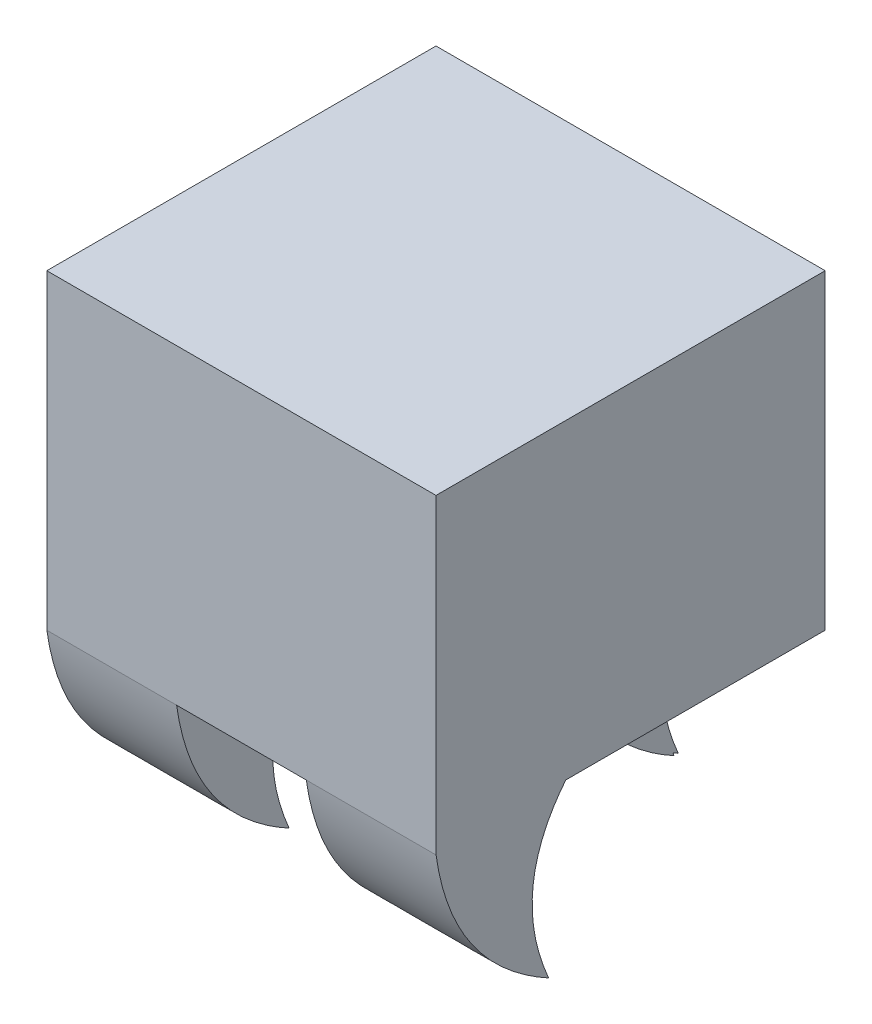
ISO-10303-21;
HEADER;
FILE_DESCRIPTION(('STEP AP214'),'2;1');
FILE_NAME('part.step','',(''),(''),'','','');
FILE_SCHEMA(('AUTOMOTIVE_DESIGN { 1 0 10303 214 1 1 1 1 }'));
ENDSEC;
DATA;
#1=APPLICATION_CONTEXT('core data for automotive mechanical design processes');
#2=APPLICATION_PROTOCOL_DEFINITION('international standard','automotive_design',2000,#1);
#3=PRODUCT_CONTEXT('',#1,'mechanical');
#4=PRODUCT('Part','Part','',(#3));
#5=PRODUCT_RELATED_PRODUCT_CATEGORY('part','',(#4));
#6=PRODUCT_DEFINITION_FORMATION('','',#4);
#7=PRODUCT_DEFINITION_CONTEXT('part definition',#1,'design');
#8=PRODUCT_DEFINITION('design','',#6,#7);
#9=PRODUCT_DEFINITION_SHAPE('','',#8);
#10=(LENGTH_UNIT() NAMED_UNIT(*) SI_UNIT(.MILLI.,.METRE.));
#11=(NAMED_UNIT(*) PLANE_ANGLE_UNIT() SI_UNIT($,.RADIAN.));
#12=(NAMED_UNIT(*) SI_UNIT($,.STERADIAN.) SOLID_ANGLE_UNIT());
#13=UNCERTAINTY_MEASURE_WITH_UNIT(LENGTH_MEASURE(1.E-05),#10,'distance_accuracy_value','');
#14=(GEOMETRIC_REPRESENTATION_CONTEXT(3) GLOBAL_UNCERTAINTY_ASSIGNED_CONTEXT((#13)) GLOBAL_UNIT_ASSIGNED_CONTEXT((#10,
#11,#12)) REPRESENTATION_CONTEXT('',''));
#15=CARTESIAN_POINT('',(0.,0.,0.));
#16=DIRECTION('',(0.,0.,1.));
#17=DIRECTION('',(1.,0.,0.));
#18=AXIS2_PLACEMENT_3D('',#15,#16,#17);
#19=CARTESIAN_POINT('',(0.,-6.,0.));
#20=DIRECTION('',(0.,-1.,0.));
#21=DIRECTION('',(0.,0.,-1.));
#22=AXIS2_PLACEMENT_3D('',#19,#20,#21);
#23=PLANE('',#22);
#24=DIRECTION('',(0.,0.,1.));
#25=VECTOR('',#24,1.);
#26=CARTESIAN_POINT('',(2.50000015448676,-6.,7.4984021115202));
#27=LINE('',#26,#25);
#28=CARTESIAN_POINT('',(2.50000015448676,-6.,2.4984021115202));
#29=VERTEX_POINT('',#28);
#30=CARTESIAN_POINT('',(2.50000015448676,-6.,7.4984021115202));
#31=VERTEX_POINT('',#30);
#32=EDGE_CURVE('E157',#29,#31,#27,.T.);
#33=ORIENTED_EDGE('',*,*,#32,.T.);
#34=DIRECTION('',(-1.,0.,0.));
#35=VECTOR('',#34,1.);
#36=CARTESIAN_POINT('',(7.50000015448676,-6.,7.4984021115202));
#37=LINE('',#36,#35);
#38=CARTESIAN_POINT('',(7.50000015448676,-6.,7.4984021115202));
#39=VERTEX_POINT('',#38);
#40=EDGE_CURVE('E148',#39,#31,#37,.T.);
#41=ORIENTED_EDGE('',*,*,#40,.F.);
#42=DIRECTION('',(0.,0.,-1.));
#43=VECTOR('',#42,1.);
#44=CARTESIAN_POINT('',(7.5,-6.,7.50000000000001));
#45=LINE('',#44,#43);
#46=CARTESIAN_POINT('',(7.5,-6.,7.50000000000001));
#47=VERTEX_POINT('',#46);
#48=EDGE_CURVE('E154',#47,#39,#45,.T.);
#49=ORIENTED_EDGE('',*,*,#48,.F.);
#50=DIRECTION('',(1.,0.,0.));
#51=VECTOR('',#50,1.);
#52=CARTESIAN_POINT('',(-7.5,-6.,7.50000000000001));
#53=LINE('',#52,#51);
#54=CARTESIAN_POINT('',(-7.5,-6.,7.50000000000001));
#55=VERTEX_POINT('',#54);
#56=EDGE_CURVE('E316',#55,#47,#53,.T.);
#57=ORIENTED_EDGE('',*,*,#56,.F.);
#58=DIRECTION('',(0.,0.,1.));
#59=VECTOR('',#58,1.);
#60=CARTESIAN_POINT('',(-7.5,-6.,7.50000000000001));
#61=LINE('',#60,#59);
#62=CARTESIAN_POINT('',(-7.5,-6.,7.4984021115202));
#63=VERTEX_POINT('',#62);
#64=EDGE_CURVE('E290',#63,#55,#61,.T.);
#65=ORIENTED_EDGE('',*,*,#64,.F.);
#66=DIRECTION('',(-1.,0.,0.));
#67=VECTOR('',#66,1.);
#68=CARTESIAN_POINT('',(-2.49999984551324,-6.,7.4984021115202));
#69=LINE('',#68,#67);
#70=CARTESIAN_POINT('',(-2.49999984551324,-6.,7.4984021115202));
#71=VERTEX_POINT('',#70);
#72=EDGE_CURVE('E344',#71,#63,#69,.T.);
#73=ORIENTED_EDGE('',*,*,#72,.F.);
#74=DIRECTION('',(0.,0.,1.));
#75=VECTOR('',#74,1.);
#76=CARTESIAN_POINT('',(-2.49999984551324,-6.,7.4984021115202));
#77=LINE('',#76,#75);
#78=CARTESIAN_POINT('',(-2.49999984551324,-6.,2.4984021115202));
#79=VERTEX_POINT('',#78);
#80=EDGE_CURVE('E342',#79,#71,#77,.T.);
#81=ORIENTED_EDGE('',*,*,#80,.F.);
#82=DIRECTION('',(-1.,0.,0.));
#83=VECTOR('',#82,1.);
#84=CARTESIAN_POINT('',(-2.49999984551324,-6.,2.4984021115202));
#85=LINE('',#84,#83);
#86=CARTESIAN_POINT('',(-7.49999984551324,-6.,2.4984021115202));
#87=VERTEX_POINT('',#86);
#88=EDGE_CURVE('E340',#79,#87,#85,.T.);
#89=ORIENTED_EDGE('',*,*,#88,.T.);
#90=CARTESIAN_POINT('',(-7.5,-6.,-7.49999999999999));
#91=VERTEX_POINT('',#90);
#92=EDGE_CURVE('E324',#91,#87,#61,.T.);
#93=ORIENTED_EDGE('',*,*,#92,.F.);
#94=DIRECTION('',(-1.,0.,0.));
#95=VECTOR('',#94,1.);
#96=CARTESIAN_POINT('',(-7.5,-6.,-7.49999999999999));
#97=LINE('',#96,#95);
#98=CARTESIAN_POINT('',(-2.5,-6.,-7.49999999999999));
#99=VERTEX_POINT('',#98);
#100=EDGE_CURVE('E291',#99,#91,#97,.T.);
#101=ORIENTED_EDGE('',*,*,#100,.F.);
#102=DIRECTION('',(0.,0.,1.));
#103=VECTOR('',#102,1.);
#104=CARTESIAN_POINT('',(-2.5,-6.,-2.49999999999999));
#105=LINE('',#104,#103);
#106=CARTESIAN_POINT('',(-2.49999984551324,-6.,-2.3415978884798));
#107=VERTEX_POINT('',#106);
#108=EDGE_CURVE('E246',#99,#107,#105,.T.);
#109=ORIENTED_EDGE('',*,*,#108,.T.);
#110=DIRECTION('',(-1.,0.,0.));
#111=VECTOR('',#110,1.);
#112=CARTESIAN_POINT('',(2.50000015448676,-6.,-2.3415978884798));
#113=LINE('',#112,#111);
#114=CARTESIAN_POINT('',(2.50000015448676,-6.,-2.3415978884798));
#115=VERTEX_POINT('',#114);
#116=EDGE_CURVE('E205',#115,#107,#113,.T.);
#117=ORIENTED_EDGE('',*,*,#116,.F.);
#118=DIRECTION('',(0.,0.,1.));
#119=VECTOR('',#118,1.);
#120=CARTESIAN_POINT('',(2.5,-6.,-2.49999999999999));
#121=LINE('',#120,#119);
#122=CARTESIAN_POINT('',(2.5,-6.,-7.49999999999999));
#123=VERTEX_POINT('',#122);
#124=EDGE_CURVE('E297',#123,#115,#121,.T.);
#125=ORIENTED_EDGE('',*,*,#124,.F.);
#126=CARTESIAN_POINT('',(7.5,-6.,-7.49999999999999));
#127=VERTEX_POINT('',#126);
#128=EDGE_CURVE('E284',#127,#123,#97,.T.);
#129=ORIENTED_EDGE('',*,*,#128,.F.);
#130=CARTESIAN_POINT('',(7.5,-6.,2.4984021115202));
#131=VERTEX_POINT('',#130);
#132=EDGE_CURVE('E307',#131,#127,#45,.T.);
#133=ORIENTED_EDGE('',*,*,#132,.F.);
#134=DIRECTION('',(-1.,0.,0.));
#135=VECTOR('',#134,1.);
#136=CARTESIAN_POINT('',(7.50000015448676,-6.,2.4984021115202));
#137=LINE('',#136,#135);
#138=EDGE_CURVE('E50',#131,#29,#137,.T.);
#139=ORIENTED_EDGE('',*,*,#138,.T.);
#140=EDGE_LOOP('',(#33,#41,#49,#57,#65,#73,#81,#89,#93,#101,#109,#117,#125,#129,#133,#139));
#141=FACE_BOUND('',#140,.T.);
#142=ADVANCED_FACE('F35',(#141),#23,.T.);
#143=CARTESIAN_POINT('',(2.5,-6.,-2.49999999999999));
#144=CARTESIAN_POINT('',(2.5,-10.2258652319823,-3.09810729333363));
#145=CARTESIAN_POINT('',(2.5,-12.2780815752041,-6.83794658172918));
#146=B_SPLINE_CURVE_WITH_KNOTS('',2,(#143,#144,#145),.UNSPECIFIED.,.F.,.F.,(3,3),(0.,1.),.UNSPECIFIED.);
#147=DIRECTION('',(-1.,0.,0.));
#148=VECTOR('',#147,1.);
#149=SURFACE_OF_LINEAR_EXTRUSION('',#146,#148);
#150=DIRECTION('',(-1.,0.,0.));
#151=VECTOR('',#150,1.);
#152=CARTESIAN_POINT('',(2.50000015448676,-12.1606154037402,-6.62953086575558));
#153=LINE('',#152,#151);
#154=CARTESIAN_POINT('',(-2.49999984551324,-12.1606154037404,-6.62953086575564));
#155=VERTEX_POINT('',#154);
#156=CARTESIAN_POINT('',(2.5,-12.1606154035908,-6.62953086549731));
#157=VERTEX_POINT('',#156);
#158=EDGE_CURVE('E236',#155,#157,#153,.F.);
#159=ORIENTED_EDGE('',*,*,#158,.F.);
#160=CARTESIAN_POINT('',(-2.5,-6.,-2.49999999999999));
#161=CARTESIAN_POINT('',(-2.5,-10.2258652319823,-3.09810729333363));
#162=CARTESIAN_POINT('',(-2.5,-12.2780815752041,-6.83794658172918));
#163=B_SPLINE_CURVE_WITH_KNOTS('',2,(#160,#161,#162),.UNSPECIFIED.,.F.,.F.,(3,3),(0.,1.),.UNSPECIFIED.);
#164=CARTESIAN_POINT('',(-2.5,-12.2780815752041,-6.83794658172918));
#165=VERTEX_POINT('',#164);
#166=EDGE_CURVE('E239',#155,#165,#163,.T.);
#167=ORIENTED_EDGE('',*,*,#166,.T.);
#168=DIRECTION('',(-1.,0.,0.));
#169=VECTOR('',#168,1.);
#170=CARTESIAN_POINT('',(2.5,-12.2780815752041,-6.83794658172918));
#171=LINE('',#170,#169);
#172=CARTESIAN_POINT('',(2.5,-12.2780815752041,-6.83794658172918));
#173=VERTEX_POINT('',#172);
#174=EDGE_CURVE('E305',#173,#165,#171,.T.);
#175=ORIENTED_EDGE('',*,*,#174,.F.);
#176=EDGE_CURVE('E240',#157,#173,#146,.T.);
#177=ORIENTED_EDGE('',*,*,#176,.F.);
#178=EDGE_LOOP('',(#159,#167,#175,#177));
#179=FACE_BOUND('',#178,.T.);
#180=ADVANCED_FACE('F255',(#179),#149,.F.);
#181=CARTESIAN_POINT('',(7.5,6.,7.50000000000001));
#182=DIRECTION('',(-1.,0.,0.));
#183=DIRECTION('',(0.,0.,1.));
#184=AXIS2_PLACEMENT_3D('',#181,#182,#183);
#185=PLANE('',#184);
#186=ORIENTED_EDGE('',*,*,#48,.T.);
#187=CARTESIAN_POINT('',(7.50000015448676,-6.,7.4984021115202));
#188=CARTESIAN_POINT('',(7.50000015448676,-10.2258652319823,6.90029481818655));
#189=CARTESIAN_POINT('',(7.50000015448676,-12.2780815752041,3.16045552979101));
#190=B_SPLINE_CURVE_WITH_KNOTS('',2,(#187,#188,#189),.UNSPECIFIED.,.F.,.F.,(3,3),(0.,1.),.UNSPECIFIED.);
#191=CARTESIAN_POINT('',(7.50000015448676,-12.2780815752041,3.16045552979101));
#192=VERTEX_POINT('',#191);
#193=EDGE_CURVE('E149',#39,#192,#190,.T.);
#194=ORIENTED_EDGE('',*,*,#193,.T.);
#195=CARTESIAN_POINT('',(7.50000015448676,-12.2780815752041,3.16045552979101));
#196=CARTESIAN_POINT('',(7.50000015448676,-8.73052741481599,4.69902568394213));
#197=CARTESIAN_POINT('',(7.50000015448676,-6.,2.4984021115202));
#198=B_SPLINE_CURVE_WITH_KNOTS('',2,(#195,#196,#197),.UNSPECIFIED.,.F.,.F.,(3,3),(0.,1.),.UNSPECIFIED.);
#199=EDGE_CURVE('E140',#192,#131,#198,.T.);
#200=ORIENTED_EDGE('',*,*,#199,.T.);
#201=ORIENTED_EDGE('',*,*,#132,.T.);
#202=DIRECTION('',(0.,-1.,0.));
#203=VECTOR('',#202,1.);
#204=CARTESIAN_POINT('',(7.5,6.,-7.49999999999999));
#205=LINE('',#204,#203);
#206=CARTESIAN_POINT('',(7.5,6.,-7.49999999999999));
#207=VERTEX_POINT('',#206);
#208=EDGE_CURVE('E11',#207,#127,#205,.T.);
#209=ORIENTED_EDGE('',*,*,#208,.F.);
#210=DIRECTION('',(0.,0.,-1.));
#211=VECTOR('',#210,1.);
#212=CARTESIAN_POINT('',(7.5,6.,7.50000000000001));
#213=LINE('',#212,#211);
#214=CARTESIAN_POINT('',(7.5,6.,7.50000000000001));
#215=VERTEX_POINT('',#214);
#216=EDGE_CURVE('E312',#215,#207,#213,.T.);
#217=ORIENTED_EDGE('',*,*,#216,.F.);
#218=DIRECTION('',(0.,-1.,0.));
#219=VECTOR('',#218,1.);
#220=CARTESIAN_POINT('',(7.5,6.,7.50000000000001));
#221=LINE('',#220,#219);
#222=EDGE_CURVE('E322',#215,#47,#221,.T.);
#223=ORIENTED_EDGE('',*,*,#222,.T.);
#224=EDGE_LOOP('',(#186,#194,#200,#201,#209,#217,#223));
#225=FACE_BOUND('',#224,.T.);
#226=ADVANCED_FACE('F37',(#225),#185,.F.);
#227=CARTESIAN_POINT('',(-7.5,6.,-7.49999999999999));
#228=DIRECTION('',(0.,0.,1.));
#229=DIRECTION('',(1.,0.,0.));
#230=AXIS2_PLACEMENT_3D('',#227,#228,#229);
#231=PLANE('',#230);
#232=ORIENTED_EDGE('',*,*,#128,.T.);
#233=DIRECTION('',(-1.,0.,0.));
#234=VECTOR('',#233,1.);
#235=CARTESIAN_POINT('',(2.5,-6.,-7.49999999999999));
#236=LINE('',#235,#234);
#237=EDGE_CURVE('E287',#123,#99,#236,.T.);
#238=ORIENTED_EDGE('',*,*,#237,.T.);
#239=ORIENTED_EDGE('',*,*,#100,.T.);
#240=DIRECTION('',(0.,-1.,0.));
#241=VECTOR('',#240,1.);
#242=CARTESIAN_POINT('',(-7.5,6.,-7.49999999999999));
#243=LINE('',#242,#241);
#244=CARTESIAN_POINT('',(-7.5,6.,-7.49999999999999));
#245=VERTEX_POINT('',#244);
#246=EDGE_CURVE('E43',#245,#91,#243,.T.);
#247=ORIENTED_EDGE('',*,*,#246,.F.);
#248=DIRECTION('',(-1.,0.,0.));
#249=VECTOR('',#248,1.);
#250=CARTESIAN_POINT('',(-7.5,6.,-7.49999999999999));
#251=LINE('',#250,#249);
#252=EDGE_CURVE('E315',#207,#245,#251,.T.);
#253=ORIENTED_EDGE('',*,*,#252,.F.);
#254=ORIENTED_EDGE('',*,*,#208,.T.);
#255=EDGE_LOOP('',(#232,#238,#239,#247,#253,#254));
#256=FACE_BOUND('',#255,.T.);
#257=ADVANCED_FACE('F275',(#256),#231,.F.);
#258=CARTESIAN_POINT('',(-7.5,6.,7.50000000000001));
#259=DIRECTION('',(1.,0.,0.));
#260=DIRECTION('',(0.,0.,-1.));
#261=AXIS2_PLACEMENT_3D('',#258,#259,#260);
#262=PLANE('',#261);
#263=ORIENTED_EDGE('',*,*,#92,.T.);
#264=CARTESIAN_POINT('',(-7.49999984551324,-12.2780815752041,3.16045552979101));
#265=CARTESIAN_POINT('',(-7.49999984551324,-8.73052741481599,4.69902568394213));
#266=CARTESIAN_POINT('',(-7.49999984551324,-6.,2.4984021115202));
#267=B_SPLINE_CURVE_WITH_KNOTS('',2,(#264,#265,#266),.UNSPECIFIED.,.F.,.F.,(3,3),(0.,1.),.UNSPECIFIED.);
#268=CARTESIAN_POINT('',(-7.49999984551324,-12.2780815752041,3.16045552979101));
#269=VERTEX_POINT('',#268);
#270=EDGE_CURVE('E163',#269,#87,#267,.T.);
#271=ORIENTED_EDGE('',*,*,#270,.F.);
#272=CARTESIAN_POINT('',(-7.49999984551324,-6.,7.4984021115202));
#273=CARTESIAN_POINT('',(-7.49999984551324,-10.2258652319823,6.90029481818655));
#274=CARTESIAN_POINT('',(-7.49999984551324,-12.2780815752041,3.16045552979101));
#275=B_SPLINE_CURVE_WITH_KNOTS('',2,(#272,#273,#274),.UNSPECIFIED.,.F.,.F.,(3,3),(0.,1.),.UNSPECIFIED.);
#276=EDGE_CURVE('E58',#63,#269,#275,.T.);
#277=ORIENTED_EDGE('',*,*,#276,.F.);
#278=ORIENTED_EDGE('',*,*,#64,.T.);
#279=DIRECTION('',(0.,-1.,0.));
#280=VECTOR('',#279,1.);
#281=CARTESIAN_POINT('',(-7.5,6.,7.50000000000001));
#282=LINE('',#281,#280);
#283=CARTESIAN_POINT('',(-7.5,6.,7.50000000000001));
#284=VERTEX_POINT('',#283);
#285=EDGE_CURVE('E329',#284,#55,#282,.T.);
#286=ORIENTED_EDGE('',*,*,#285,.F.);
#287=DIRECTION('',(0.,0.,1.));
#288=VECTOR('',#287,1.);
#289=CARTESIAN_POINT('',(-7.5,6.,7.50000000000001));
#290=LINE('',#289,#288);
#291=EDGE_CURVE('E318',#245,#284,#290,.T.);
#292=ORIENTED_EDGE('',*,*,#291,.F.);
#293=ORIENTED_EDGE('',*,*,#246,.T.);
#294=EDGE_LOOP('',(#263,#271,#277,#278,#286,#292,#293));
#295=FACE_BOUND('',#294,.T.);
#296=ADVANCED_FACE('F272',(#295),#262,.F.);
#297=CARTESIAN_POINT('',(-7.5,6.,7.50000000000001));
#298=DIRECTION('',(0.,0.,-1.));
#299=DIRECTION('',(-1.,0.,0.));
#300=AXIS2_PLACEMENT_3D('',#297,#298,#299);
#301=PLANE('',#300);
#302=ORIENTED_EDGE('',*,*,#56,.T.);
#303=ORIENTED_EDGE('',*,*,#222,.F.);
#304=DIRECTION('',(1.,0.,0.));
#305=VECTOR('',#304,1.);
#306=CARTESIAN_POINT('',(-7.5,6.,7.50000000000001));
#307=LINE('',#306,#305);
#308=EDGE_CURVE('E320',#284,#215,#307,.T.);
#309=ORIENTED_EDGE('',*,*,#308,.F.);
#310=ORIENTED_EDGE('',*,*,#285,.T.);
#311=EDGE_LOOP('',(#302,#303,#309,#310));
#312=FACE_BOUND('',#311,.T.);
#313=ADVANCED_FACE('F265',(#312),#301,.F.);
#314=CARTESIAN_POINT('',(0.,6.,0.));
#315=DIRECTION('',(0.,-1.,0.));
#316=DIRECTION('',(0.,0.,-1.));
#317=AXIS2_PLACEMENT_3D('',#314,#315,#316);
#318=PLANE('',#317);
#319=ORIENTED_EDGE('',*,*,#216,.T.);
#320=ORIENTED_EDGE('',*,*,#252,.T.);
#321=ORIENTED_EDGE('',*,*,#291,.T.);
#322=ORIENTED_EDGE('',*,*,#308,.T.);
#323=EDGE_LOOP('',(#319,#320,#321,#322));
#324=FACE_BOUND('',#323,.T.);
#325=ADVANCED_FACE('F262',(#324),#318,.F.);
#326=CARTESIAN_POINT('',(2.5,-12.2780815752041,-6.83794658172918));
#327=CARTESIAN_POINT('',(2.5,-8.73052741481599,-5.29937642757806));
#328=CARTESIAN_POINT('',(2.5,-6.,-7.49999999999999));
#329=B_SPLINE_CURVE_WITH_KNOTS('',2,(#326,#327,#328),.UNSPECIFIED.,.F.,.F.,(3,3),(0.,1.),.UNSPECIFIED.);
#330=DIRECTION('',(-1.,0.,0.));
#331=VECTOR('',#330,1.);
#332=SURFACE_OF_LINEAR_EXTRUSION('',#329,#331);
#333=CARTESIAN_POINT('',(-2.5,-12.2780815752041,-6.83794658172918));
#334=CARTESIAN_POINT('',(-2.5,-8.73052741481599,-5.29937642757806));
#335=CARTESIAN_POINT('',(-2.5,-6.,-7.49999999999999));
#336=B_SPLINE_CURVE_WITH_KNOTS('',2,(#333,#334,#335),.UNSPECIFIED.,.F.,.F.,(3,3),(0.,1.),.UNSPECIFIED.);
#337=EDGE_CURVE('E303',#165,#99,#336,.T.);
#338=ORIENTED_EDGE('',*,*,#337,.T.);
#339=ORIENTED_EDGE('',*,*,#237,.F.);
#340=EDGE_CURVE('E245',#173,#123,#329,.T.);
#341=ORIENTED_EDGE('',*,*,#340,.F.);
#342=ORIENTED_EDGE('',*,*,#174,.T.);
#343=EDGE_LOOP('',(#338,#339,#341,#342));
#344=FACE_BOUND('',#343,.T.);
#345=ADVANCED_FACE('F260',(#344),#332,.F.);
#346=CARTESIAN_POINT('',(2.5,-9.68245300979215,-3.88354029209911));
#347=DIRECTION('',(-1.,0.,0.));
#348=DIRECTION('',(0.,0.,1.));
#349=AXIS2_PLACEMENT_3D('',#346,#347,#348);
#350=PLANE('',#349);
#351=ORIENTED_EDGE('',*,*,#124,.T.);
#352=CARTESIAN_POINT('',(2.50000015448676,-6.,-2.3415978884798));
#353=CARTESIAN_POINT('',(2.50000015448676,-10.2258652319823,-2.93970518181344));
#354=CARTESIAN_POINT('',(2.50000015448676,-12.2780815752041,-6.67954447020899));
#355=B_SPLINE_CURVE_WITH_KNOTS('',2,(#352,#353,#354),.UNSPECIFIED.,.F.,.F.,(3,3),(0.,1.),.UNSPECIFIED.);
#356=CARTESIAN_POINT('',(2.50000015448676,-12.2780815752041,-6.67954447020899));
#357=VERTEX_POINT('',#356);
#358=EDGE_CURVE('E206',#115,#357,#355,.T.);
#359=ORIENTED_EDGE('',*,*,#358,.T.);
#360=CARTESIAN_POINT('',(2.50000015448676,-12.2780815752041,-6.67954447020899));
#361=CARTESIAN_POINT('',(2.50000015448676,-8.73052741481599,-5.14097431605787));
#362=CARTESIAN_POINT('',(2.50000015448676,-6.,-7.3415978884798));
#363=B_SPLINE_CURVE_WITH_KNOTS('',2,(#360,#361,#362),.UNSPECIFIED.,.F.,.F.,(3,3),(0.,1.),.UNSPECIFIED.);
#364=EDGE_CURVE('E199',#357,#157,#363,.T.);
#365=ORIENTED_EDGE('',*,*,#364,.T.);
#366=ORIENTED_EDGE('',*,*,#176,.T.);
#367=ORIENTED_EDGE('',*,*,#340,.T.);
#368=EDGE_LOOP('',(#351,#359,#365,#366,#367));
#369=FACE_BOUND('',#368,.T.);
#370=ADVANCED_FACE('F295',(#369),#350,.F.);
#371=CARTESIAN_POINT('',(-2.5,-9.68245300979215,-3.88354029209911));
#372=DIRECTION('',(-1.,0.,0.));
#373=DIRECTION('',(0.,0.,1.));
#374=AXIS2_PLACEMENT_3D('',#371,#372,#373);
#375=PLANE('',#374);
#376=CARTESIAN_POINT('',(-2.49999984551324,-6.,-2.3415978884798));
#377=CARTESIAN_POINT('',(-2.49999984551324,-10.2258652319823,-2.93970518181344));
#378=CARTESIAN_POINT('',(-2.49999984551324,-12.2780815752041,-6.67954447020899));
#379=B_SPLINE_CURVE_WITH_KNOTS('',2,(#376,#377,#378),.UNSPECIFIED.,.F.,.F.,(3,3),(0.,1.),.UNSPECIFIED.);
#380=CARTESIAN_POINT('',(-2.49999984551324,-12.2780815752041,-6.67954447020899));
#381=VERTEX_POINT('',#380);
#382=EDGE_CURVE('E211',#107,#381,#379,.T.);
#383=ORIENTED_EDGE('',*,*,#382,.F.);
#384=ORIENTED_EDGE('',*,*,#108,.F.);
#385=ORIENTED_EDGE('',*,*,#337,.F.);
#386=ORIENTED_EDGE('',*,*,#166,.F.);
#387=CARTESIAN_POINT('',(-2.49999984551324,-12.2780815752041,-6.67954447020899));
#388=CARTESIAN_POINT('',(-2.49999984551324,-8.73052741481599,-5.14097431605787));
#389=CARTESIAN_POINT('',(-2.49999984551324,-6.,-7.3415978884798));
#390=B_SPLINE_CURVE_WITH_KNOTS('',2,(#387,#388,#389),.UNSPECIFIED.,.F.,.F.,(3,3),(0.,1.),.UNSPECIFIED.);
#391=EDGE_CURVE('E219',#381,#155,#390,.T.);
#392=ORIENTED_EDGE('',*,*,#391,.F.);
#393=EDGE_LOOP('',(#383,#384,#385,#386,#392));
#394=FACE_BOUND('',#393,.T.);
#395=ADVANCED_FACE('F195',(#394),#375,.T.);
#396=DIRECTION('',(-1.,0.,0.));
#397=VECTOR('',#396,1.);
#398=SURFACE_OF_LINEAR_EXTRUSION('',#363,#397);
#399=ORIENTED_EDGE('',*,*,#391,.T.);
#400=ORIENTED_EDGE('',*,*,#158,.T.);
#401=ORIENTED_EDGE('',*,*,#364,.F.);
#402=DIRECTION('',(-1.,0.,0.));
#403=VECTOR('',#402,1.);
#404=CARTESIAN_POINT('',(2.50000015448676,-12.2780815752041,-6.67954447020899));
#405=LINE('',#404,#403);
#406=EDGE_CURVE('E233',#357,#381,#405,.T.);
#407=ORIENTED_EDGE('',*,*,#406,.T.);
#408=EDGE_LOOP('',(#399,#400,#401,#407));
#409=FACE_BOUND('',#408,.T.);
#410=ADVANCED_FACE('F191',(#409),#398,.F.);
#411=DIRECTION('',(-1.,0.,0.));
#412=VECTOR('',#411,1.);
#413=SURFACE_OF_LINEAR_EXTRUSION('',#355,#412);
#414=ORIENTED_EDGE('',*,*,#382,.T.);
#415=ORIENTED_EDGE('',*,*,#406,.F.);
#416=ORIENTED_EDGE('',*,*,#358,.F.);
#417=ORIENTED_EDGE('',*,*,#116,.T.);
#418=EDGE_LOOP('',(#414,#415,#416,#417));
#419=FACE_BOUND('',#418,.T.);
#420=ADVANCED_FACE('F188',(#419),#413,.F.);
#421=CARTESIAN_POINT('',(-2.49999984551324,-6.,7.4984021115202));
#422=CARTESIAN_POINT('',(-2.49999984551324,-10.2258652319823,6.90029481818655));
#423=CARTESIAN_POINT('',(-2.49999984551324,-12.2780815752041,3.16045552979101));
#424=B_SPLINE_CURVE_WITH_KNOTS('',2,(#421,#422,#423),.UNSPECIFIED.,.F.,.F.,(3,3),(0.,1.),.UNSPECIFIED.);
#425=DIRECTION('',(-1.,0.,0.));
#426=VECTOR('',#425,1.);
#427=SURFACE_OF_LINEAR_EXTRUSION('',#424,#426);
#428=ORIENTED_EDGE('',*,*,#276,.T.);
#429=DIRECTION('',(-1.,0.,0.));
#430=VECTOR('',#429,1.);
#431=CARTESIAN_POINT('',(-2.49999984551324,-12.2780815752041,3.16045552979101));
#432=LINE('',#431,#430);
#433=CARTESIAN_POINT('',(-2.49999984551324,-12.2780815752041,3.16045552979101));
#434=VERTEX_POINT('',#433);
#435=EDGE_CURVE('E220',#434,#269,#432,.T.);
#436=ORIENTED_EDGE('',*,*,#435,.F.);
#437=EDGE_CURVE('E168',#71,#434,#424,.T.);
#438=ORIENTED_EDGE('',*,*,#437,.F.);
#439=ORIENTED_EDGE('',*,*,#72,.T.);
#440=EDGE_LOOP('',(#428,#436,#438,#439));
#441=FACE_BOUND('',#440,.T.);
#442=ADVANCED_FACE('F183',(#441),#427,.F.);
#443=CARTESIAN_POINT('',(-2.49999984551324,-12.2780815752041,3.16045552979101));
#444=CARTESIAN_POINT('',(-2.49999984551324,-8.73052741481599,4.69902568394213));
#445=CARTESIAN_POINT('',(-2.49999984551324,-6.,2.4984021115202));
#446=B_SPLINE_CURVE_WITH_KNOTS('',2,(#443,#444,#445),.UNSPECIFIED.,.F.,.F.,(3,3),(0.,1.),.UNSPECIFIED.);
#447=DIRECTION('',(-1.,0.,0.));
#448=VECTOR('',#447,1.);
#449=SURFACE_OF_LINEAR_EXTRUSION('',#446,#448);
#450=ORIENTED_EDGE('',*,*,#270,.T.);
#451=ORIENTED_EDGE('',*,*,#88,.F.);
#452=EDGE_CURVE('E174',#434,#79,#446,.T.);
#453=ORIENTED_EDGE('',*,*,#452,.F.);
#454=ORIENTED_EDGE('',*,*,#435,.T.);
#455=EDGE_LOOP('',(#450,#451,#453,#454));
#456=FACE_BOUND('',#455,.T.);
#457=ADVANCED_FACE('F187',(#456),#449,.F.);
#458=CARTESIAN_POINT('',(-2.49999984551324,-9.68245300979215,6.11486181942108));
#459=DIRECTION('',(-1.,0.,0.));
#460=DIRECTION('',(0.,0.,1.));
#461=AXIS2_PLACEMENT_3D('',#458,#459,#460);
#462=PLANE('',#461);
#463=ORIENTED_EDGE('',*,*,#437,.T.);
#464=ORIENTED_EDGE('',*,*,#452,.T.);
#465=ORIENTED_EDGE('',*,*,#80,.T.);
#466=EDGE_LOOP('',(#463,#464,#465));
#467=FACE_BOUND('',#466,.T.);
#468=ADVANCED_FACE('F361',(#467),#462,.F.);
#469=DIRECTION('',(-1.,0.,0.));
#470=VECTOR('',#469,1.);
#471=SURFACE_OF_LINEAR_EXTRUSION('',#190,#470);
#472=CARTESIAN_POINT('',(2.50000015448676,-6.,7.4984021115202));
#473=CARTESIAN_POINT('',(2.50000015448676,-10.2258652319823,6.90029481818655));
#474=CARTESIAN_POINT('',(2.50000015448676,-12.2780815752041,3.16045552979101));
#475=B_SPLINE_CURVE_WITH_KNOTS('',2,(#472,#473,#474),.UNSPECIFIED.,.F.,.F.,(3,3),(0.,1.),.UNSPECIFIED.);
#476=CARTESIAN_POINT('',(2.50000015448676,-12.2780815752041,3.16045552979101));
#477=VERTEX_POINT('',#476);
#478=EDGE_CURVE('E161',#31,#477,#475,.T.);
#479=ORIENTED_EDGE('',*,*,#478,.T.);
#480=DIRECTION('',(-1.,0.,0.));
#481=VECTOR('',#480,1.);
#482=CARTESIAN_POINT('',(7.50000015448676,-12.2780815752041,3.16045552979101));
#483=LINE('',#482,#481);
#484=EDGE_CURVE('E144',#192,#477,#483,.T.);
#485=ORIENTED_EDGE('',*,*,#484,.F.);
#486=ORIENTED_EDGE('',*,*,#193,.F.);
#487=ORIENTED_EDGE('',*,*,#40,.T.);
#488=EDGE_LOOP('',(#479,#485,#486,#487));
#489=FACE_BOUND('',#488,.T.);
#490=ADVANCED_FACE('F159',(#489),#471,.F.);
#491=DIRECTION('',(-1.,0.,0.));
#492=VECTOR('',#491,1.);
#493=SURFACE_OF_LINEAR_EXTRUSION('',#198,#492);
#494=CARTESIAN_POINT('',(2.50000015448676,-12.2780815752041,3.16045552979101));
#495=CARTESIAN_POINT('',(2.50000015448676,-8.73052741481599,4.69902568394213));
#496=CARTESIAN_POINT('',(2.50000015448676,-6.,2.4984021115202));
#497=B_SPLINE_CURVE_WITH_KNOTS('',2,(#494,#495,#496),.UNSPECIFIED.,.F.,.F.,(3,3),(0.,1.),.UNSPECIFIED.);
#498=EDGE_CURVE('E370',#477,#29,#497,.T.);
#499=ORIENTED_EDGE('',*,*,#498,.T.);
#500=ORIENTED_EDGE('',*,*,#138,.F.);
#501=ORIENTED_EDGE('',*,*,#199,.F.);
#502=ORIENTED_EDGE('',*,*,#484,.T.);
#503=EDGE_LOOP('',(#499,#500,#501,#502));
#504=FACE_BOUND('',#503,.T.);
#505=ADVANCED_FACE('F142',(#504),#493,.F.);
#506=CARTESIAN_POINT('',(2.50000015448676,-9.68245300979215,6.11486181942108));
#507=DIRECTION('',(-1.,0.,0.));
#508=DIRECTION('',(0.,0.,1.));
#509=AXIS2_PLACEMENT_3D('',#506,#507,#508);
#510=PLANE('',#509);
#511=ORIENTED_EDGE('',*,*,#478,.F.);
#512=ORIENTED_EDGE('',*,*,#32,.F.);
#513=ORIENTED_EDGE('',*,*,#498,.F.);
#514=EDGE_LOOP('',(#511,#512,#513));
#515=FACE_BOUND('',#514,.T.);
#516=ADVANCED_FACE('F376',(#515),#510,.T.);
#517=CLOSED_SHELL('',(#142,#180,#226,#257,#296,#313,#325,#345,#370,#395,#410,#420,#442,#457,
#468,#490,#505,#516));
#518=MANIFOLD_SOLID_BREP('B2',#517);
#519=ADVANCED_BREP_SHAPE_REPRESENTATION('',(#18,#518),#14);
#520=SHAPE_DEFINITION_REPRESENTATION(#9,#519);
ENDSEC;
END-ISO-10303-21;
